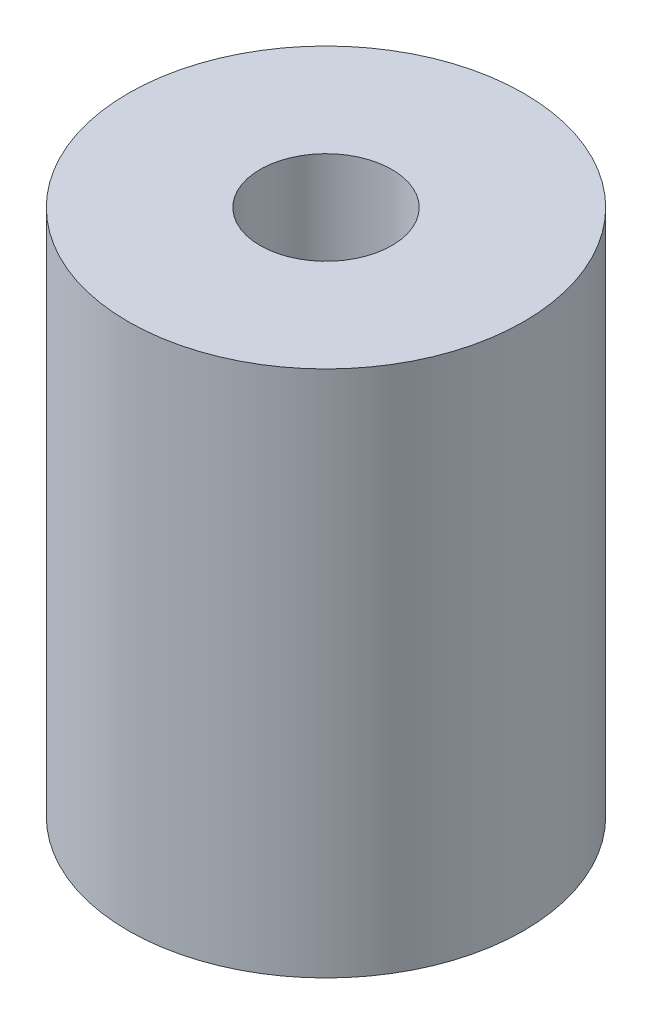
ISO-10303-21;
HEADER;
FILE_DESCRIPTION(('STEP AP214'),'2;1');
FILE_NAME('part.step','',(''),(''),'','','');
FILE_SCHEMA(('AUTOMOTIVE_DESIGN { 1 0 10303 214 1 1 1 1 }'));
ENDSEC;
DATA;
#1=APPLICATION_CONTEXT('core data for automotive mechanical design processes');
#2=APPLICATION_PROTOCOL_DEFINITION('international standard','automotive_design',2000,#1);
#3=PRODUCT_CONTEXT('',#1,'mechanical');
#4=PRODUCT('Part','Part','',(#3));
#5=PRODUCT_RELATED_PRODUCT_CATEGORY('part','',(#4));
#6=PRODUCT_DEFINITION_FORMATION('','',#4);
#7=PRODUCT_DEFINITION_CONTEXT('part definition',#1,'design');
#8=PRODUCT_DEFINITION('design','',#6,#7);
#9=PRODUCT_DEFINITION_SHAPE('','',#8);
#10=(LENGTH_UNIT() NAMED_UNIT(*) SI_UNIT(.MILLI.,.METRE.));
#11=(NAMED_UNIT(*) PLANE_ANGLE_UNIT() SI_UNIT($,.RADIAN.));
#12=(NAMED_UNIT(*) SI_UNIT($,.STERADIAN.) SOLID_ANGLE_UNIT());
#13=UNCERTAINTY_MEASURE_WITH_UNIT(LENGTH_MEASURE(1.E-05),#10,'distance_accuracy_value','');
#14=(GEOMETRIC_REPRESENTATION_CONTEXT(3) GLOBAL_UNCERTAINTY_ASSIGNED_CONTEXT((#13)) GLOBAL_UNIT_ASSIGNED_CONTEXT((#10,
#11,#12)) REPRESENTATION_CONTEXT('',''));
#15=CARTESIAN_POINT('',(0.,0.,0.));
#16=DIRECTION('',(0.,0.,1.));
#17=DIRECTION('',(1.,0.,0.));
#18=AXIS2_PLACEMENT_3D('',#15,#16,#17);
#19=CARTESIAN_POINT('',(0.,12.7,0.));
#20=DIRECTION('',(0.,-1.,0.));
#21=DIRECTION('',(0.,0.,-1.));
#22=AXIS2_PLACEMENT_3D('',#19,#20,#21);
#23=CYLINDRICAL_SURFACE('',#22,1.5875);
#24=CARTESIAN_POINT('',(0.,4.23333333333333,0.));
#25=DIRECTION('',(0.,1.,0.));
#26=DIRECTION('',(0.,0.,1.));
#27=AXIS2_PLACEMENT_3D('',#24,#25,#26);
#28=CIRCLE('',#27,1.5875);
#29=CARTESIAN_POINT('',(0.,4.23333333333333,1.5875));
#30=VERTEX_POINT('',#29);
#31=EDGE_CURVE('E44',#30,#30,#28,.T.);
#32=ORIENTED_EDGE('',*,*,#31,.T.);
#33=EDGE_LOOP('',(#32));
#34=FACE_BOUND('',#33,.T.);
#35=CARTESIAN_POINT('',(0.,-4.23333333333334,0.));
#36=DIRECTION('',(0.,-1.,0.));
#37=DIRECTION('',(0.,0.,-1.));
#38=AXIS2_PLACEMENT_3D('',#35,#36,#37);
#39=CIRCLE('',#38,1.5875);
#40=CARTESIAN_POINT('',(0.,-4.23333333333334,-1.5875));
#41=VERTEX_POINT('',#40);
#42=EDGE_CURVE('E35',#41,#41,#39,.T.);
#43=ORIENTED_EDGE('',*,*,#42,.T.);
#44=EDGE_LOOP('',(#43));
#45=FACE_BOUND('',#44,.T.);
#46=ADVANCED_FACE('F31',(#34,#45),#23,.F.);
#47=CARTESIAN_POINT('',(0.,12.7,0.));
#48=DIRECTION('',(0.,1.,0.));
#49=DIRECTION('',(0.,0.,1.));
#50=AXIS2_PLACEMENT_3D('',#47,#48,#49);
#51=PLANE('',#50);
#52=CARTESIAN_POINT('',(0.,12.7,0.));
#53=DIRECTION('',(0.,1.,0.));
#54=DIRECTION('',(0.,0.,1.));
#55=AXIS2_PLACEMENT_3D('',#52,#53,#54);
#56=CIRCLE('',#55,3.175);
#57=CARTESIAN_POINT('',(0.,12.7,3.175));
#58=VERTEX_POINT('',#57);
#59=EDGE_CURVE('E47',#58,#58,#56,.T.);
#60=ORIENTED_EDGE('',*,*,#59,.F.);
#61=EDGE_LOOP('',(#60));
#62=FACE_BOUND('',#61,.T.);
#63=CARTESIAN_POINT('',(0.,12.7,0.));
#64=DIRECTION('',(0.,1.,0.));
#65=DIRECTION('',(0.,0.,1.));
#66=AXIS2_PLACEMENT_3D('',#63,#64,#65);
#67=CIRCLE('',#66,9.525);
#68=CARTESIAN_POINT('',(0.,12.7,9.525));
#69=VERTEX_POINT('',#68);
#70=EDGE_CURVE('E10',#69,#69,#67,.T.);
#71=ORIENTED_EDGE('',*,*,#70,.T.);
#72=EDGE_LOOP('',(#71));
#73=FACE_BOUND('',#72,.T.);
#74=ADVANCED_FACE('F80',(#62,#73),#51,.T.);
#75=CARTESIAN_POINT('',(0.,-12.7,0.));
#76=DIRECTION('',(0.,1.,0.));
#77=DIRECTION('',(0.,0.,1.));
#78=AXIS2_PLACEMENT_3D('',#75,#76,#77);
#79=PLANE('',#78);
#80=CARTESIAN_POINT('',(0.,-12.7,0.));
#81=DIRECTION('',(0.,1.,0.));
#82=DIRECTION('',(0.,0.,1.));
#83=AXIS2_PLACEMENT_3D('',#80,#81,#82);
#84=CIRCLE('',#83,3.175);
#85=CARTESIAN_POINT('',(0.,-12.7,3.175));
#86=VERTEX_POINT('',#85);
#87=EDGE_CURVE('E58',#86,#86,#84,.T.);
#88=ORIENTED_EDGE('',*,*,#87,.T.);
#89=EDGE_LOOP('',(#88));
#90=FACE_BOUND('',#89,.T.);
#91=CARTESIAN_POINT('',(0.,-12.7,0.));
#92=DIRECTION('',(0.,1.,0.));
#93=DIRECTION('',(0.,0.,1.));
#94=AXIS2_PLACEMENT_3D('',#91,#92,#93);
#95=CIRCLE('',#94,9.525);
#96=CARTESIAN_POINT('',(0.,-12.7,9.525));
#97=VERTEX_POINT('',#96);
#98=EDGE_CURVE('E39',#97,#97,#95,.T.);
#99=ORIENTED_EDGE('',*,*,#98,.F.);
#100=EDGE_LOOP('',(#99));
#101=FACE_BOUND('',#100,.T.);
#102=ADVANCED_FACE('F85',(#90,#101),#79,.F.);
#103=CARTESIAN_POINT('',(0.,12.7,0.));
#104=DIRECTION('',(0.,-1.,0.));
#105=DIRECTION('',(0.,0.,-1.));
#106=AXIS2_PLACEMENT_3D('',#103,#104,#105);
#107=CYLINDRICAL_SURFACE('',#106,9.525);
#108=ORIENTED_EDGE('',*,*,#70,.F.);
#109=EDGE_LOOP('',(#108));
#110=FACE_BOUND('',#109,.T.);
#111=ORIENTED_EDGE('',*,*,#98,.T.);
#112=EDGE_LOOP('',(#111));
#113=FACE_BOUND('',#112,.T.);
#114=ADVANCED_FACE('F33',(#110,#113),#107,.T.);
#115=CARTESIAN_POINT('',(0.,4.23333333333333,0.));
#116=DIRECTION('',(0.,1.,0.));
#117=DIRECTION('',(0.,0.,1.));
#118=AXIS2_PLACEMENT_3D('',#115,#116,#117);
#119=CYLINDRICAL_SURFACE('',#118,3.175);
#120=CARTESIAN_POINT('',(0.,4.23333333333333,0.));
#121=DIRECTION('',(0.,1.,0.));
#122=DIRECTION('',(0.,0.,1.));
#123=AXIS2_PLACEMENT_3D('',#120,#121,#122);
#124=CIRCLE('',#123,3.175);
#125=CARTESIAN_POINT('',(0.,4.23333333333333,3.175));
#126=VERTEX_POINT('',#125);
#127=EDGE_CURVE('E50',#126,#126,#124,.T.);
#128=ORIENTED_EDGE('',*,*,#127,.F.);
#129=EDGE_LOOP('',(#128));
#130=FACE_BOUND('',#129,.T.);
#131=ORIENTED_EDGE('',*,*,#59,.T.);
#132=EDGE_LOOP('',(#131));
#133=FACE_BOUND('',#132,.T.);
#134=ADVANCED_FACE('F89',(#130,#133),#119,.F.);
#135=CARTESIAN_POINT('',(0.,4.23333333333333,0.));
#136=DIRECTION('',(0.,1.,0.));
#137=DIRECTION('',(0.,0.,1.));
#138=AXIS2_PLACEMENT_3D('',#135,#136,#137);
#139=PLANE('',#138);
#140=ORIENTED_EDGE('',*,*,#31,.F.);
#141=EDGE_LOOP('',(#140));
#142=FACE_BOUND('',#141,.T.);
#143=ORIENTED_EDGE('',*,*,#127,.T.);
#144=EDGE_LOOP('',(#143));
#145=FACE_BOUND('',#144,.T.);
#146=ADVANCED_FACE('F77',(#142,#145),#139,.T.);
#147=CARTESIAN_POINT('',(0.,-4.23333333333333,0.));
#148=DIRECTION('',(0.,-1.,0.));
#149=DIRECTION('',(0.,0.,-1.));
#150=AXIS2_PLACEMENT_3D('',#147,#148,#149);
#151=CYLINDRICAL_SURFACE('',#150,3.175);
#152=CARTESIAN_POINT('',(0.,-4.23333333333333,0.));
#153=DIRECTION('',(0.,1.,0.));
#154=DIRECTION('',(0.,0.,1.));
#155=AXIS2_PLACEMENT_3D('',#152,#153,#154);
#156=CIRCLE('',#155,3.175);
#157=CARTESIAN_POINT('',(0.,-4.23333333333333,3.175));
#158=VERTEX_POINT('',#157);
#159=EDGE_CURVE('E61',#158,#158,#156,.T.);
#160=ORIENTED_EDGE('',*,*,#159,.T.);
#161=EDGE_LOOP('',(#160));
#162=FACE_BOUND('',#161,.T.);
#163=ORIENTED_EDGE('',*,*,#87,.F.);
#164=EDGE_LOOP('',(#163));
#165=FACE_BOUND('',#164,.T.);
#166=ADVANCED_FACE('F72',(#162,#165),#151,.F.);
#167=CARTESIAN_POINT('',(0.,-4.23333333333333,0.));
#168=DIRECTION('',(0.,-1.,0.));
#169=DIRECTION('',(0.,0.,1.));
#170=AXIS2_PLACEMENT_3D('',#167,#168,#169);
#171=PLANE('',#170);
#172=ORIENTED_EDGE('',*,*,#42,.F.);
#173=EDGE_LOOP('',(#172));
#174=FACE_BOUND('',#173,.T.);
#175=ORIENTED_EDGE('',*,*,#159,.F.);
#176=EDGE_LOOP('',(#175));
#177=FACE_BOUND('',#176,.T.);
#178=ADVANCED_FACE('F69',(#174,#177),#171,.T.);
#179=CLOSED_SHELL('',(#46,#74,#102,#114,#134,#146,#166,#178));
#180=MANIFOLD_SOLID_BREP('B2',#179);
#181=ADVANCED_BREP_SHAPE_REPRESENTATION('',(#18,#180),#14);
#182=SHAPE_DEFINITION_REPRESENTATION(#9,#181);
ENDSEC;
END-ISO-10303-21;
